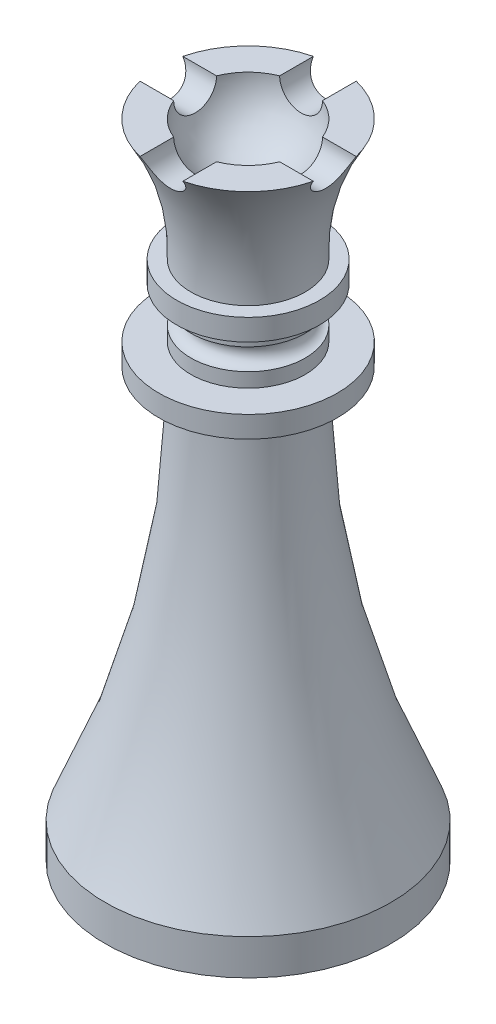
ISO-10303-21;
HEADER;
FILE_DESCRIPTION(('STEP AP214'),'2;1');
FILE_NAME('part.step','',(''),(''),'','','');
FILE_SCHEMA(('AUTOMOTIVE_DESIGN { 1 0 10303 214 1 1 1 1 }'));
ENDSEC;
DATA;
#1=APPLICATION_CONTEXT('core data for automotive mechanical design processes');
#2=APPLICATION_PROTOCOL_DEFINITION('international standard','automotive_design',2000,#1);
#3=PRODUCT_CONTEXT('',#1,'mechanical');
#4=PRODUCT('Part','Part','',(#3));
#5=PRODUCT_RELATED_PRODUCT_CATEGORY('part','',(#4));
#6=PRODUCT_DEFINITION_FORMATION('','',#4);
#7=PRODUCT_DEFINITION_CONTEXT('part definition',#1,'design');
#8=PRODUCT_DEFINITION('design','',#6,#7);
#9=PRODUCT_DEFINITION_SHAPE('','',#8);
#10=(LENGTH_UNIT() NAMED_UNIT(*) SI_UNIT(.MILLI.,.METRE.));
#11=(NAMED_UNIT(*) PLANE_ANGLE_UNIT() SI_UNIT($,.RADIAN.));
#12=(NAMED_UNIT(*) SI_UNIT($,.STERADIAN.) SOLID_ANGLE_UNIT());
#13=UNCERTAINTY_MEASURE_WITH_UNIT(LENGTH_MEASURE(1.E-05),#10,'distance_accuracy_value','');
#14=(GEOMETRIC_REPRESENTATION_CONTEXT(3) GLOBAL_UNCERTAINTY_ASSIGNED_CONTEXT((#13)) GLOBAL_UNIT_ASSIGNED_CONTEXT((#10,
#11,#12)) REPRESENTATION_CONTEXT('',''));
#15=CARTESIAN_POINT('',(0.,0.,0.));
#16=DIRECTION('',(0.,0.,1.));
#17=DIRECTION('',(1.,0.,0.));
#18=AXIS2_PLACEMENT_3D('',#15,#16,#17);
#19=CARTESIAN_POINT('',(4.8,18.,0.));
#20=DIRECTION('',(0.,1.,0.));
#21=DIRECTION('',(0.,0.,1.));
#22=AXIS2_PLACEMENT_3D('',#19,#20,#21);
#23=PLANE('',#22);
#24=DIRECTION('',(1.,0.,0.));
#25=VECTOR('',#24,1.);
#26=CARTESIAN_POINT('',(-12.0006000000001,18.,1.79999999999987));
#27=LINE('',#26,#25);
#28=CARTESIAN_POINT('',(-4.44971909225742,18.,1.79999999999995));
#29=VERTEX_POINT('',#28);
#30=CARTESIAN_POINT('',(-7.28079665970697,18.,1.79999999999992));
#31=VERTEX_POINT('',#30);
#32=EDGE_CURVE('E50',#29,#31,#27,.F.);
#33=ORIENTED_EDGE('',*,*,#32,.T.);
#34=CARTESIAN_POINT('',(0.,18.,0.));
#35=DIRECTION('',(0.,-1.,0.));
#36=DIRECTION('',(0.,0.,-1.));
#37=AXIS2_PLACEMENT_3D('',#34,#35,#36);
#38=CIRCLE('',#37,7.49999999999999);
#39=CARTESIAN_POINT('',(-1.8,18.,7.28079665970695));
#40=VERTEX_POINT('',#39);
#41=EDGE_CURVE('E132',#40,#31,#38,.T.);
#42=ORIENTED_EDGE('',*,*,#41,.F.);
#43=DIRECTION('',(0.,0.,-1.));
#44=VECTOR('',#43,1.);
#45=CARTESIAN_POINT('',(-1.8,18.,12.0006));
#46=LINE('',#45,#44);
#47=CARTESIAN_POINT('',(-1.8,18.,4.4497190922574));
#48=VERTEX_POINT('',#47);
#49=EDGE_CURVE('E146',#40,#48,#46,.T.);
#50=ORIENTED_EDGE('',*,*,#49,.T.);
#51=CARTESIAN_POINT('',(0.,18.,0.));
#52=DIRECTION('',(0.,-1.,0.));
#53=DIRECTION('',(0.,0.,-1.));
#54=AXIS2_PLACEMENT_3D('',#51,#52,#53);
#55=CIRCLE('',#54,4.8);
#56=EDGE_CURVE('E119',#48,#29,#55,.T.);
#57=ORIENTED_EDGE('',*,*,#56,.T.);
#58=EDGE_LOOP('',(#33,#42,#50,#57));
#59=FACE_BOUND('',#58,.T.);
#60=ADVANCED_FACE('F35',(#59),#23,.T.);
#61=DIRECTION('',(0.,0.,-1.));
#62=VECTOR('',#61,1.);
#63=CARTESIAN_POINT('',(1.8,18.,12.0006));
#64=LINE('',#63,#62);
#65=CARTESIAN_POINT('',(1.8,18.,4.4497190922574));
#66=VERTEX_POINT('',#65);
#67=CARTESIAN_POINT('',(1.8,18.,7.28079665970695));
#68=VERTEX_POINT('',#67);
#69=EDGE_CURVE('E58',#66,#68,#64,.F.);
#70=ORIENTED_EDGE('',*,*,#69,.T.);
#71=CARTESIAN_POINT('',(7.28079665970695,18.,1.80000000000003));
#72=VERTEX_POINT('',#71);
#73=EDGE_CURVE('E217',#72,#68,#38,.T.);
#74=ORIENTED_EDGE('',*,*,#73,.F.);
#75=DIRECTION('',(-1.,0.,0.));
#76=VECTOR('',#75,1.);
#77=CARTESIAN_POINT('',(12.0006,18.,1.80000000000004));
#78=LINE('',#77,#76);
#79=CARTESIAN_POINT('',(4.44971909225739,18.,1.80000000000002));
#80=VERTEX_POINT('',#79);
#81=EDGE_CURVE('E141',#72,#80,#78,.T.);
#82=ORIENTED_EDGE('',*,*,#81,.T.);
#83=EDGE_CURVE('E123',#80,#66,#55,.T.);
#84=ORIENTED_EDGE('',*,*,#83,.T.);
#85=EDGE_LOOP('',(#70,#74,#82,#84));
#86=FACE_BOUND('',#85,.T.);
#87=ADVANCED_FACE('F138',(#86),#23,.T.);
#88=DIRECTION('',(-1.,0.,0.));
#89=VECTOR('',#88,1.);
#90=CARTESIAN_POINT('',(12.0006000000001,18.,-1.79999999999996));
#91=LINE('',#90,#89);
#92=CARTESIAN_POINT('',(4.4497190922574,18.,-1.79999999999998));
#93=VERTEX_POINT('',#92);
#94=CARTESIAN_POINT('',(7.28079665970696,18.,-1.79999999999997));
#95=VERTEX_POINT('',#94);
#96=EDGE_CURVE('E206',#93,#95,#91,.F.);
#97=ORIENTED_EDGE('',*,*,#96,.T.);
#98=CARTESIAN_POINT('',(1.8,18.,-7.28079665970695));
#99=VERTEX_POINT('',#98);
#100=EDGE_CURVE('E133',#99,#95,#38,.T.);
#101=ORIENTED_EDGE('',*,*,#100,.F.);
#102=DIRECTION('',(0.,0.,1.));
#103=VECTOR('',#102,1.);
#104=CARTESIAN_POINT('',(1.8,18.,-12.0006));
#105=LINE('',#104,#103);
#106=CARTESIAN_POINT('',(1.8,18.,-4.4497190922574));
#107=VERTEX_POINT('',#106);
#108=EDGE_CURVE('E451',#99,#107,#105,.T.);
#109=ORIENTED_EDGE('',*,*,#108,.T.);
#110=EDGE_CURVE('E122',#107,#93,#55,.T.);
#111=ORIENTED_EDGE('',*,*,#110,.T.);
#112=EDGE_LOOP('',(#97,#101,#109,#111));
#113=FACE_BOUND('',#112,.T.);
#114=ADVANCED_FACE('F187',(#113),#23,.T.);
#115=CARTESIAN_POINT('',(0.,-1.2,0.));
#116=DIRECTION('',(0.,-1.,0.));
#117=DIRECTION('',(0.,0.,-1.));
#118=AXIS2_PLACEMENT_3D('',#115,#116,#117);
#119=TOROIDAL_SURFACE('',#118,6.00520466909825,1.2);
#120=CARTESIAN_POINT('',(0.,0.,0.));
#121=DIRECTION('',(0.,-1.,0.));
#122=DIRECTION('',(0.,0.,-1.));
#123=AXIS2_PLACEMENT_3D('',#120,#121,#122);
#124=CIRCLE('',#123,6.00520466909825);
#125=CARTESIAN_POINT('',(0.,0.,-6.00520466909825));
#126=VERTEX_POINT('',#125);
#127=EDGE_CURVE('E11',#126,#126,#124,.T.);
#128=ORIENTED_EDGE('',*,*,#127,.T.);
#129=EDGE_LOOP('',(#128));
#130=FACE_BOUND('',#129,.T.);
#131=CARTESIAN_POINT('',(0.,-1.2145723013904,0.));
#132=DIRECTION('',(0.,-1.,0.));
#133=DIRECTION('',(0.,0.,-1.));
#134=AXIS2_PLACEMENT_3D('',#131,#132,#133);
#135=CIRCLE('',#134,4.80529315234703);
#136=CARTESIAN_POINT('',(0.,-1.2145723013904,-4.80529315234703));
#137=VERTEX_POINT('',#136);
#138=EDGE_CURVE('E460',#137,#137,#135,.T.);
#139=ORIENTED_EDGE('',*,*,#138,.F.);
#140=EDGE_LOOP('',(#139));
#141=FACE_BOUND('',#140,.T.);
#142=ADVANCED_FACE('F37',(#130,#141),#119,.F.);
#143=CARTESIAN_POINT('',(6.00520466909825,0.,0.));
#144=DIRECTION('',(0.,-1.,0.));
#145=DIRECTION('',(0.,0.,-1.));
#146=AXIS2_PLACEMENT_3D('',#143,#144,#145);
#147=PLANE('',#146);
#148=CARTESIAN_POINT('',(0.,0.,0.));
#149=DIRECTION('',(0.,-1.,0.));
#150=DIRECTION('',(0.,0.,-1.));
#151=AXIS2_PLACEMENT_3D('',#148,#149,#150);
#152=CIRCLE('',#151,7.5);
#153=CARTESIAN_POINT('',(0.,0.,-7.5));
#154=VERTEX_POINT('',#153);
#155=EDGE_CURVE('E43',#154,#154,#152,.T.);
#156=ORIENTED_EDGE('',*,*,#155,.T.);
#157=EDGE_LOOP('',(#156));
#158=FACE_BOUND('',#157,.T.);
#159=ORIENTED_EDGE('',*,*,#127,.F.);
#160=EDGE_LOOP('',(#159));
#161=FACE_BOUND('',#160,.T.);
#162=ADVANCED_FACE('F203',(#158,#161),#147,.T.);
#163=CARTESIAN_POINT('',(0.,0.,0.));
#164=DIRECTION('',(0.,-1.,0.));
#165=DIRECTION('',(0.,0.,-1.));
#166=AXIS2_PLACEMENT_3D('',#163,#164,#165);
#167=CYLINDRICAL_SURFACE('',#166,7.5);
#168=CARTESIAN_POINT('',(0.,1.8,0.));
#169=DIRECTION('',(0.,-1.,0.));
#170=DIRECTION('',(0.,0.,-1.));
#171=AXIS2_PLACEMENT_3D('',#168,#169,#170);
#172=CIRCLE('',#171,7.5);
#173=CARTESIAN_POINT('',(0.,1.8,-7.5));
#174=VERTEX_POINT('',#173);
#175=EDGE_CURVE('E239',#174,#174,#172,.T.);
#176=ORIENTED_EDGE('',*,*,#175,.T.);
#177=EDGE_LOOP('',(#176));
#178=FACE_BOUND('',#177,.T.);
#179=ORIENTED_EDGE('',*,*,#155,.F.);
#180=EDGE_LOOP('',(#179));
#181=FACE_BOUND('',#180,.T.);
#182=ADVANCED_FACE('F246',(#178,#181),#167,.T.);
#183=CARTESIAN_POINT('',(7.5,1.8,0.));
#184=DIRECTION('',(0.,1.,0.));
#185=DIRECTION('',(0.,0.,1.));
#186=AXIS2_PLACEMENT_3D('',#183,#184,#185);
#187=PLANE('',#186);
#188=CARTESIAN_POINT('',(0.,1.8,0.));
#189=DIRECTION('',(0.,-1.,0.));
#190=DIRECTION('',(0.,0.,-1.));
#191=AXIS2_PLACEMENT_3D('',#188,#189,#190);
#192=CIRCLE('',#191,4.8);
#193=CARTESIAN_POINT('',(0.,1.8,-4.8));
#194=VERTEX_POINT('',#193);
#195=EDGE_CURVE('E236',#194,#194,#192,.T.);
#196=ORIENTED_EDGE('',*,*,#195,.T.);
#197=EDGE_LOOP('',(#196));
#198=FACE_BOUND('',#197,.T.);
#199=ORIENTED_EDGE('',*,*,#175,.F.);
#200=EDGE_LOOP('',(#199));
#201=FACE_BOUND('',#200,.T.);
#202=ADVANCED_FACE('F248',(#198,#201),#187,.T.);
#203=CARTESIAN_POINT('',(0.,0.,0.));
#204=DIRECTION('',(0.,-1.,0.));
#205=DIRECTION('',(0.,0.,-1.));
#206=AXIS2_PLACEMENT_3D('',#203,#204,#205);
#207=CYLINDRICAL_SURFACE('',#206,4.8);
#208=CARTESIAN_POINT('',(0.,3.,0.));
#209=DIRECTION('',(0.,-1.,0.));
#210=DIRECTION('',(0.,0.,-1.));
#211=AXIS2_PLACEMENT_3D('',#208,#209,#210);
#212=CIRCLE('',#211,4.8);
#213=CARTESIAN_POINT('',(0.,3.,-4.8));
#214=VERTEX_POINT('',#213);
#215=EDGE_CURVE('E233',#214,#214,#212,.T.);
#216=ORIENTED_EDGE('',*,*,#215,.T.);
#217=EDGE_LOOP('',(#216));
#218=FACE_BOUND('',#217,.T.);
#219=ORIENTED_EDGE('',*,*,#195,.F.);
#220=EDGE_LOOP('',(#219));
#221=FACE_BOUND('',#220,.T.);
#222=ADVANCED_FACE('F255',(#218,#221),#207,.T.);
#223=CARTESIAN_POINT('',(0.,3.9,0.));
#224=DIRECTION('',(0.,-1.,0.));
#225=DIRECTION('',(0.,0.,-1.));
#226=AXIS2_PLACEMENT_3D('',#223,#224,#225);
#227=TOROIDAL_SURFACE('',#226,4.8,0.9);
#228=CARTESIAN_POINT('',(0.,4.8,0.));
#229=DIRECTION('',(0.,-1.,0.));
#230=DIRECTION('',(0.,0.,-1.));
#231=AXIS2_PLACEMENT_3D('',#228,#229,#230);
#232=CIRCLE('',#231,4.8);
#233=CARTESIAN_POINT('',(0.,4.8,-4.8));
#234=VERTEX_POINT('',#233);
#235=EDGE_CURVE('E230',#234,#234,#232,.T.);
#236=ORIENTED_EDGE('',*,*,#235,.T.);
#237=EDGE_LOOP('',(#236));
#238=FACE_BOUND('',#237,.T.);
#239=ORIENTED_EDGE('',*,*,#215,.F.);
#240=EDGE_LOOP('',(#239));
#241=FACE_BOUND('',#240,.T.);
#242=ADVANCED_FACE('F261',(#238,#241),#227,.F.);
#243=CARTESIAN_POINT('',(0.,0.,0.));
#244=DIRECTION('',(0.,-1.,0.));
#245=DIRECTION('',(0.,0.,-1.));
#246=AXIS2_PLACEMENT_3D('',#243,#244,#245);
#247=CYLINDRICAL_SURFACE('',#246,4.8);
#248=CARTESIAN_POINT('',(0.,6.,0.));
#249=DIRECTION('',(0.,-1.,0.));
#250=DIRECTION('',(0.,0.,-1.));
#251=AXIS2_PLACEMENT_3D('',#248,#249,#250);
#252=CIRCLE('',#251,4.8);
#253=CARTESIAN_POINT('',(0.,6.,-4.8));
#254=VERTEX_POINT('',#253);
#255=EDGE_CURVE('E227',#254,#254,#252,.T.);
#256=ORIENTED_EDGE('',*,*,#255,.T.);
#257=EDGE_LOOP('',(#256));
#258=FACE_BOUND('',#257,.T.);
#259=ORIENTED_EDGE('',*,*,#235,.F.);
#260=EDGE_LOOP('',(#259));
#261=FACE_BOUND('',#260,.T.);
#262=ADVANCED_FACE('F265',(#258,#261),#247,.T.);
#263=CARTESIAN_POINT('',(4.8,6.,0.));
#264=DIRECTION('',(0.,-1.,0.));
#265=DIRECTION('',(0.,0.,-1.));
#266=AXIS2_PLACEMENT_3D('',#263,#264,#265);
#267=PLANE('',#266);
#268=CARTESIAN_POINT('',(0.,6.,0.));
#269=DIRECTION('',(0.,-1.,0.));
#270=DIRECTION('',(0.,0.,-1.));
#271=AXIS2_PLACEMENT_3D('',#268,#269,#270);
#272=CIRCLE('',#271,6.);
#273=CARTESIAN_POINT('',(0.,6.,-6.));
#274=VERTEX_POINT('',#273);
#275=EDGE_CURVE('E224',#274,#274,#272,.T.);
#276=ORIENTED_EDGE('',*,*,#275,.T.);
#277=EDGE_LOOP('',(#276));
#278=FACE_BOUND('',#277,.T.);
#279=ORIENTED_EDGE('',*,*,#255,.F.);
#280=EDGE_LOOP('',(#279));
#281=FACE_BOUND('',#280,.T.);
#282=ADVANCED_FACE('F269',(#278,#281),#267,.T.);
#283=CARTESIAN_POINT('',(0.,0.,0.));
#284=DIRECTION('',(0.,-1.,0.));
#285=DIRECTION('',(0.,0.,-1.));
#286=AXIS2_PLACEMENT_3D('',#283,#284,#285);
#287=CYLINDRICAL_SURFACE('',#286,6.);
#288=CARTESIAN_POINT('',(0.,7.8,0.));
#289=DIRECTION('',(0.,-1.,0.));
#290=DIRECTION('',(0.,0.,-1.));
#291=AXIS2_PLACEMENT_3D('',#288,#289,#290);
#292=CIRCLE('',#291,6.);
#293=CARTESIAN_POINT('',(0.,7.8,-6.));
#294=VERTEX_POINT('',#293);
#295=EDGE_CURVE('E219',#294,#294,#292,.T.);
#296=ORIENTED_EDGE('',*,*,#295,.T.);
#297=EDGE_LOOP('',(#296));
#298=FACE_BOUND('',#297,.T.);
#299=ORIENTED_EDGE('',*,*,#275,.F.);
#300=EDGE_LOOP('',(#299));
#301=FACE_BOUND('',#300,.T.);
#302=ADVANCED_FACE('F273',(#298,#301),#287,.T.);
#303=CARTESIAN_POINT('',(6.,7.8,0.));
#304=DIRECTION('',(0.,1.,0.));
#305=DIRECTION('',(0.,0.,1.));
#306=AXIS2_PLACEMENT_3D('',#303,#304,#305);
#307=PLANE('',#306);
#308=CARTESIAN_POINT('',(0.,7.8,0.));
#309=DIRECTION('',(0.,-1.,0.));
#310=DIRECTION('',(0.,0.,-1.));
#311=AXIS2_PLACEMENT_3D('',#308,#309,#310);
#312=CIRCLE('',#311,4.8);
#313=CARTESIAN_POINT('',(0.,7.8,-4.8));
#314=VERTEX_POINT('',#313);
#315=EDGE_CURVE('E216',#314,#314,#312,.T.);
#316=ORIENTED_EDGE('',*,*,#315,.T.);
#317=EDGE_LOOP('',(#316));
#318=FACE_BOUND('',#317,.T.);
#319=ORIENTED_EDGE('',*,*,#295,.F.);
#320=EDGE_LOOP('',(#319));
#321=FACE_BOUND('',#320,.T.);
#322=ADVANCED_FACE('F197',(#318,#321),#307,.T.);
#323=CARTESIAN_POINT('',(0.,8.49621244997309,0.));
#324=DIRECTION('',(0.,-1.,0.));
#325=DIRECTION('',(0.,0.,-1.));
#326=AXIS2_PLACEMENT_3D('',#323,#324,#325);
#327=TOROIDAL_SURFACE('',#326,22.7865307445461,18.);
#328=CARTESIAN_POINT('',(-7.28087351267607,18.00012,1.79999999599992));
#329=CARTESIAN_POINT('',(-7.24916617027994,17.9506223303307,1.80000215189279));
#330=CARTESIAN_POINT('',(-7.21805172621514,17.9007251378603,1.79796411662472));
#331=CARTESIAN_POINT('',(-7.15722805121233,17.8003749392502,1.78960593091639));
#332=CARTESIAN_POINT('',(-7.12752015664346,17.7499214585342,1.78328179223978));
#333=CARTESIAN_POINT('',(-7.06960466253087,17.648472319788,1.7660942121074));
#334=CARTESIAN_POINT('',(-7.04140785623858,17.597475257003,1.75520203855294));
#335=CARTESIAN_POINT('',(-6.98698157246766,17.4956909632383,1.72871134919193));
#336=CARTESIAN_POINT('',(-6.96075155315397,17.4449036781368,1.71311413558055));
#337=CARTESIAN_POINT('',(-6.88504352640613,17.2928834323424,1.65878766276784));
#338=CARTESIAN_POINT('',(-6.83884610541201,17.1925151329813,1.61260682870859));
#339=CARTESIAN_POINT('',(-6.75678019145648,16.9993777584201,1.50038994989352));
#340=CARTESIAN_POINT('',(-6.72087600032118,16.9065832376743,1.43442419168422));
#341=CARTESIAN_POINT('',(-6.66330321412852,16.7448100534106,1.2939949132804));
#342=CARTESIAN_POINT('',(-6.64038232546986,16.674304381268,1.22179590806877));
#343=CARTESIAN_POINT('',(-6.60145681274396,16.5456428856014,1.06540911029223));
#344=CARTESIAN_POINT('',(-6.58545635623346,16.487494514464,0.981214134083377));
#345=CARTESIAN_POINT('',(-6.55998968365932,16.3888871413604,0.808489692967561));
#346=CARTESIAN_POINT('',(-6.55020861997914,16.3476219920511,0.720464409230753));
#347=CARTESIAN_POINT('',(-6.53482212550733,16.2797369937203,0.53861961897347));
#348=CARTESIAN_POINT('',(-6.52921572661702,16.2531137496368,0.444801461280314));
#349=CARTESIAN_POINT('',(-6.52138761421463,16.2151598327125,0.252987567009421));
#350=CARTESIAN_POINT('',(-6.51920109238057,16.2039882968441,0.154958925295463));
#351=CARTESIAN_POINT('',(-6.51797714866226,16.1977957332527,-0.0416371081884089));
#352=CARTESIAN_POINT('',(-6.51894013192743,16.2027767833826,-0.140204567643051));
#353=CARTESIAN_POINT('',(-6.52419512901589,16.2288582600712,-0.336001575315837));
#354=CARTESIAN_POINT('',(-6.52851697791746,16.2501031242723,-0.433211143638304));
#355=CARTESIAN_POINT('',(-6.54116902238999,16.3081951497803,-0.622577296306479));
#356=CARTESIAN_POINT('',(-6.54949898738394,16.3450414135625,-0.714734170981491));
#357=CARTESIAN_POINT('',(-6.5710938631276,16.4328193459814,-0.890824617257295));
#358=CARTESIAN_POINT('',(-6.58433178513552,16.4836735990227,-0.974800047080801));
#359=CARTESIAN_POINT('',(-6.61679771000035,16.597647841684,-1.13264282743203));
#360=CARTESIAN_POINT('',(-6.63602437814315,16.6607650970659,-1.20651242497605));
#361=CARTESIAN_POINT('',(-6.68096570563203,16.7958246445256,-1.34124461454933));
#362=CARTESIAN_POINT('',(-6.70658749236937,16.8676336175698,-1.40227213024131));
#363=CARTESIAN_POINT('',(-6.76472214580957,17.0179549494183,-1.51136207733418));
#364=CARTESIAN_POINT('',(-6.79723479794307,17.096467099452,-1.55942491232643));
#365=CARTESIAN_POINT('',(-6.86964488948432,17.2592019158343,-1.6431022342097));
#366=CARTESIAN_POINT('',(-6.90969229368526,17.3435134199238,-1.67841164336858));
#367=CARTESIAN_POINT('',(-6.99585254581702,17.5136687992768,-1.73537914236019));
#368=CARTESIAN_POINT('',(-7.04196946845849,17.5995136701892,-1.75702800423845));
#369=CARTESIAN_POINT('',(-7.12061107921281,17.7380923403486,-1.78166033014048));
#370=CARTESIAN_POINT('',(-7.15164605937848,17.7910191251901,-1.78861008181122));
#371=CARTESIAN_POINT('',(-7.21519684792118,17.8961434025204,-1.79777149136061));
#372=CARTESIAN_POINT('',(-7.24770713490367,17.9483427903359,-1.79999953226508));
#373=CARTESIAN_POINT('',(-7.28087351267603,18.00012,-1.79999999600008));
#374=B_SPLINE_CURVE_WITH_KNOTS('',3,(#328,#329,#330,#331,#332,#333,#334,#335,#336,#337,#338,
#339,#340,#341,#342,#343,#344,#345,#346,#347,#348,#349,#350,#351,#352,#353,#354,#355,#356,#357,
#358,#359,#360,#361,#362,#363,#364,#365,#366,#367,#368,#369,#370,#371,#372,#373),.UNSPECIFIED.,
.F.,.F.,(4,2,2,2,2,2,2,2,2,2,2,2,2,2,2,2,2,2,2,2,2,2,4),(0.,0.176331092545598,0.352826487557667,
0.530449061959675,0.708022521502711,1.06496793454961,1.42066001275283,1.7294910741004,
2.03850785867151,2.33027781927276,2.62198009775566,2.91666479175441,3.21138739521068,
3.50875821302089,3.80611192586775,4.10185418091668,4.39753057088123,4.68914024376748,
4.9807408377779,5.27891557694475,5.57729152368256,5.76234758561024,5.94676049594349),.UNSPECIFIED.);
#375=CARTESIAN_POINT('',(-7.28079665970693,18.,-1.80000000000008));
#376=VERTEX_POINT('',#375);
#377=EDGE_CURVE('E147',#31,#376,#374,.T.);
#378=ORIENTED_EDGE('',*,*,#377,.T.);
#379=CARTESIAN_POINT('',(-1.8,18.,-7.28079665970695));
#380=VERTEX_POINT('',#379);
#381=EDGE_CURVE('E113',#376,#380,#38,.T.);
#382=ORIENTED_EDGE('',*,*,#381,.T.);
#383=CARTESIAN_POINT('',(-1.799999996,18.00012,-7.28087351267605));
#384=CARTESIAN_POINT('',(-1.80000215189286,17.9506223303307,-7.24916617027993));
#385=CARTESIAN_POINT('',(-1.79796411662479,17.9007251378603,-7.21805172621512));
#386=CARTESIAN_POINT('',(-1.78960593091647,17.8003749392502,-7.15722805121231));
#387=CARTESIAN_POINT('',(-1.78328179223986,17.7499214585342,-7.12752015664344));
#388=CARTESIAN_POINT('',(-1.76609421210747,17.648472319788,-7.06960466253086));
#389=CARTESIAN_POINT('',(-1.75520203855302,17.597475257003,-7.04140785623857));
#390=CARTESIAN_POINT('',(-1.728711349192,17.4956909632383,-6.98698157246765));
#391=CARTESIAN_POINT('',(-1.71311413558062,17.4449036781368,-6.96075155315395));
#392=CARTESIAN_POINT('',(-1.65878766276791,17.2928834323424,-6.88504352640611));
#393=CARTESIAN_POINT('',(-1.61260682870866,17.1925151329813,-6.83884610541199));
#394=CARTESIAN_POINT('',(-1.50038994989359,16.9993777584201,-6.75678019145646));
#395=CARTESIAN_POINT('',(-1.4344241916843,16.9065832376743,-6.72087600032118));
#396=CARTESIAN_POINT('',(-1.29399491328047,16.7448100534106,-6.66330321412851));
#397=CARTESIAN_POINT('',(-1.22179590806885,16.674304381268,-6.64038232546985));
#398=CARTESIAN_POINT('',(-1.0654091102923,16.5456428856014,-6.60145681274395));
#399=CARTESIAN_POINT('',(-0.981214134083451,16.487494514464,-6.58545635623346));
#400=CARTESIAN_POINT('',(-0.808489692967636,16.3888871413604,-6.55998968365932));
#401=CARTESIAN_POINT('',(-0.720464409230828,16.3476219920511,-6.55020861997914));
#402=CARTESIAN_POINT('',(-0.538619618973545,16.2797369937203,-6.53482212550733));
#403=CARTESIAN_POINT('',(-0.444801461280389,16.2531137496368,-6.52921572661702));
#404=CARTESIAN_POINT('',(-0.252987567009496,16.2151598327125,-6.52138761421463));
#405=CARTESIAN_POINT('',(-0.154958925295538,16.2039882968441,-6.51920109238057));
#406=CARTESIAN_POINT('',(0.0416371081883339,16.1977957332527,-6.51797714866226));
#407=CARTESIAN_POINT('',(0.140204567642976,16.2027767833826,-6.51894013192743));
#408=CARTESIAN_POINT('',(0.336001575315762,16.2288582600712,-6.52419512901589));
#409=CARTESIAN_POINT('',(0.433211143638228,16.2501031242723,-6.52851697791747));
#410=CARTESIAN_POINT('',(0.622577296306404,16.3081951497803,-6.54116902239));
#411=CARTESIAN_POINT('',(0.714734170981417,16.3450414135625,-6.54949898738395));
#412=CARTESIAN_POINT('',(0.890824617257222,16.4328193459813,-6.57109386312761));
#413=CARTESIAN_POINT('',(0.974800047080727,16.4836735990227,-6.58433178513553));
#414=CARTESIAN_POINT('',(1.13264282743195,16.597647841684,-6.61679771000037));
#415=CARTESIAN_POINT('',(1.20651242497598,16.6607650970658,-6.63602437814316));
#416=CARTESIAN_POINT('',(1.34124461454925,16.7958246445256,-6.68096570563204));
#417=CARTESIAN_POINT('',(1.40227213024123,16.8676336175698,-6.70658749236939));
#418=CARTESIAN_POINT('',(1.51136207733411,17.0179549494183,-6.76472214580959));
#419=CARTESIAN_POINT('',(1.55942491232636,17.096467099452,-6.79723479794309));
#420=CARTESIAN_POINT('',(1.64310223420962,17.2592019158343,-6.86964488948434));
#421=CARTESIAN_POINT('',(1.6784116433685,17.3435134199238,-6.90969229368528));
#422=CARTESIAN_POINT('',(1.73537914236011,17.5136687992768,-6.99585254581704));
#423=CARTESIAN_POINT('',(1.75702800423838,17.5995136701892,-7.04196946845851));
#424=CARTESIAN_POINT('',(1.78166033014041,17.7380923403486,-7.12061107921283));
#425=CARTESIAN_POINT('',(1.78861008181115,17.7910191251901,-7.1516460593785));
#426=CARTESIAN_POINT('',(1.79777149136053,17.8961434025204,-7.2151968479212));
#427=CARTESIAN_POINT('',(1.799999532265,17.9483427903359,-7.24770713490369));
#428=CARTESIAN_POINT('',(1.799999996,18.00012,-7.28087351267605));
#429=B_SPLINE_CURVE_WITH_KNOTS('',3,(#383,#384,#385,#386,#387,#388,#389,#390,#391,#392,#393,
#394,#395,#396,#397,#398,#399,#400,#401,#402,#403,#404,#405,#406,#407,#408,#409,#410,#411,#412,
#413,#414,#415,#416,#417,#418,#419,#420,#421,#422,#423,#424,#425,#426,#427,#428),.UNSPECIFIED.,
.F.,.F.,(4,2,2,2,2,2,2,2,2,2,2,2,2,2,2,2,2,2,2,2,2,2,4),(0.,0.176331092545597,0.352826487557667,
0.53044906195967,0.708022521502708,1.06496793454961,1.42066001275283,1.72949107410039,
2.03850785867151,2.33027781927275,2.62198009775565,2.9166647917544,3.21138739521067,
3.50875821302088,3.80611192586774,4.10185418091667,4.39753057088122,4.68914024376748,
4.98074083777789,5.27891557694475,5.57729152368256,5.76234758561023,5.94676049594348),.UNSPECIFIED.);
#430=EDGE_CURVE('E215',#380,#99,#429,.T.);
#431=ORIENTED_EDGE('',*,*,#430,.T.);
#432=ORIENTED_EDGE('',*,*,#100,.T.);
#433=CARTESIAN_POINT('',(7.28087351267606,18.00012,-1.79999999599997));
#434=CARTESIAN_POINT('',(7.24916617027993,17.9506223303307,-1.80000215189284));
#435=CARTESIAN_POINT('',(7.21805172621513,17.9007251378603,-1.79796411662477));
#436=CARTESIAN_POINT('',(7.15722805121232,17.8003749392502,-1.78960593091644));
#437=CARTESIAN_POINT('',(7.12752015664345,17.7499214585342,-1.78328179223983));
#438=CARTESIAN_POINT('',(7.06960466253086,17.648472319788,-1.76609421210745));
#439=CARTESIAN_POINT('',(7.04140785623857,17.597475257003,-1.75520203855299));
#440=CARTESIAN_POINT('',(6.98698157246766,17.4956909632383,-1.72871134919198));
#441=CARTESIAN_POINT('',(6.96075155315396,17.4449036781368,-1.7131141355806));
#442=CARTESIAN_POINT('',(6.88504352640612,17.2928834323424,-1.65878766276789));
#443=CARTESIAN_POINT('',(6.838846105412,17.1925151329813,-1.61260682870864));
#444=CARTESIAN_POINT('',(6.75678019145647,16.9993777584201,-1.50038994989357));
#445=CARTESIAN_POINT('',(6.72087600032117,16.9065832376743,-1.43442419168427));
#446=CARTESIAN_POINT('',(6.66330321412851,16.7448100534106,-1.29399491328045));
#447=CARTESIAN_POINT('',(6.64038232546985,16.674304381268,-1.22179590806882));
#448=CARTESIAN_POINT('',(6.60145681274395,16.5456428856014,-1.06540911029228));
#449=CARTESIAN_POINT('',(6.58545635623346,16.487494514464,-0.981214134083425));
#450=CARTESIAN_POINT('',(6.55998968365932,16.3888871413604,-0.808489692967608));
#451=CARTESIAN_POINT('',(6.55020861997914,16.3476219920511,-0.7204644092308));
#452=CARTESIAN_POINT('',(6.53482212550733,16.2797369937203,-0.538619618973518));
#453=CARTESIAN_POINT('',(6.52921572661702,16.2531137496368,-0.444801461280361));
#454=CARTESIAN_POINT('',(6.52138761421463,16.2151598327125,-0.252987567009468));
#455=CARTESIAN_POINT('',(6.51920109238057,16.2039882968441,-0.15495892529551));
#456=CARTESIAN_POINT('',(6.51797714866226,16.1977957332527,0.041637108188361));
#457=CARTESIAN_POINT('',(6.51894013192743,16.2027767833826,0.140204567643003));
#458=CARTESIAN_POINT('',(6.52419512901589,16.2288582600712,0.336001575315789));
#459=CARTESIAN_POINT('',(6.52851697791747,16.2501031242723,0.433211143638256));
#460=CARTESIAN_POINT('',(6.54116902239,16.3081951497803,0.622577296306432));
#461=CARTESIAN_POINT('',(6.54949898738394,16.3450414135625,0.714734170981444));
#462=CARTESIAN_POINT('',(6.57109386312761,16.4328193459813,0.890824617257247));
#463=CARTESIAN_POINT('',(6.58433178513553,16.4836735990227,0.974800047080752));
#464=CARTESIAN_POINT('',(6.61679771000036,16.597647841684,1.13264282743198));
#465=CARTESIAN_POINT('',(6.63602437814315,16.6607650970659,1.20651242497601));
#466=CARTESIAN_POINT('',(6.68096570563204,16.7958246445256,1.34124461454928));
#467=CARTESIAN_POINT('',(6.70658749236938,16.8676336175698,1.40227213024126));
#468=CARTESIAN_POINT('',(6.76472214580959,17.0179549494183,1.51136207733414));
#469=CARTESIAN_POINT('',(6.79723479794308,17.096467099452,1.55942491232638));
#470=CARTESIAN_POINT('',(6.86964488948433,17.2592019158343,1.64310223420965));
#471=CARTESIAN_POINT('',(6.90969229368527,17.3435134199238,1.67841164336853));
#472=CARTESIAN_POINT('',(6.99585254581703,17.5136687992768,1.73537914236014));
#473=CARTESIAN_POINT('',(7.04196946845851,17.5995136701892,1.7570280042384));
#474=CARTESIAN_POINT('',(7.12061107921282,17.7380923403486,1.78166033014043));
#475=CARTESIAN_POINT('',(7.15164605937849,17.7910191251901,1.78861008181117));
#476=CARTESIAN_POINT('',(7.2151968479212,17.8961434025204,1.79777149136056));
#477=CARTESIAN_POINT('',(7.24770713490369,17.9483427903359,1.79999953226502));
#478=CARTESIAN_POINT('',(7.28087351267604,18.00012,1.79999999600003));
#479=B_SPLINE_CURVE_WITH_KNOTS('',3,(#433,#434,#435,#436,#437,#438,#439,#440,#441,#442,#443,
#444,#445,#446,#447,#448,#449,#450,#451,#452,#453,#454,#455,#456,#457,#458,#459,#460,#461,#462,
#463,#464,#465,#466,#467,#468,#469,#470,#471,#472,#473,#474,#475,#476,#477,#478),.UNSPECIFIED.,
.F.,.F.,(4,2,2,2,2,2,2,2,2,2,2,2,2,2,2,2,2,2,2,2,2,2,4),(0.,0.176331092545599,0.352826487557668,
0.530449061959671,0.708022521502709,1.06496793454961,1.42066001275283,1.72949107410039,
2.03850785867151,2.33027781927276,2.62198009775565,2.91666479175441,3.21138739521068,
3.50875821302088,3.80611192586775,4.10185418091668,4.39753057088123,4.68914024376748,
4.98074083777789,5.27891557694475,5.57729152368256,5.76234758561024,5.94676049594348),.UNSPECIFIED.);
#480=EDGE_CURVE('E209',#95,#72,#479,.T.);
#481=ORIENTED_EDGE('',*,*,#480,.T.);
#482=ORIENTED_EDGE('',*,*,#73,.T.);
#483=CARTESIAN_POINT('',(1.799999996,18.00012,7.28087351267605));
#484=CARTESIAN_POINT('',(1.80000215189286,17.9506223303307,7.24916617027993));
#485=CARTESIAN_POINT('',(1.79796411662479,17.9007251378603,7.21805172621512));
#486=CARTESIAN_POINT('',(1.78960593091647,17.8003749392502,7.15722805121231));
#487=CARTESIAN_POINT('',(1.78328179223986,17.7499214585342,7.12752015664344));
#488=CARTESIAN_POINT('',(1.76609421210747,17.648472319788,7.06960466253086));
#489=CARTESIAN_POINT('',(1.75520203855302,17.597475257003,7.04140785623857));
#490=CARTESIAN_POINT('',(1.728711349192,17.4956909632383,6.98698157246765));
#491=CARTESIAN_POINT('',(1.71311413558062,17.4449036781368,6.96075155315395));
#492=CARTESIAN_POINT('',(1.65878766276791,17.2928834323424,6.88504352640611));
#493=CARTESIAN_POINT('',(1.61260682870866,17.1925151329813,6.83884610541199));
#494=CARTESIAN_POINT('',(1.50038994989359,16.9993777584201,6.75678019145646));
#495=CARTESIAN_POINT('',(1.4344241916843,16.9065832376743,6.72087600032118));
#496=CARTESIAN_POINT('',(1.29399491328047,16.7448100534106,6.66330321412851));
#497=CARTESIAN_POINT('',(1.22179590806885,16.674304381268,6.64038232546985));
#498=CARTESIAN_POINT('',(1.0654091102923,16.5456428856014,6.60145681274395));
#499=CARTESIAN_POINT('',(0.981214134083451,16.487494514464,6.58545635623346));
#500=CARTESIAN_POINT('',(0.808489692967636,16.3888871413604,6.55998968365932));
#501=CARTESIAN_POINT('',(0.720464409230828,16.3476219920511,6.55020861997914));
#502=CARTESIAN_POINT('',(0.538619618973545,16.2797369937203,6.53482212550733));
#503=CARTESIAN_POINT('',(0.444801461280389,16.2531137496368,6.52921572661702));
#504=CARTESIAN_POINT('',(0.252987567009496,16.2151598327125,6.52138761421463));
#505=CARTESIAN_POINT('',(0.154958925295538,16.2039882968441,6.51920109238057));
#506=CARTESIAN_POINT('',(-0.0416371081883339,16.1977957332527,6.51797714866226));
#507=CARTESIAN_POINT('',(-0.140204567642976,16.2027767833826,6.51894013192743));
#508=CARTESIAN_POINT('',(-0.336001575315762,16.2288582600712,6.52419512901589));
#509=CARTESIAN_POINT('',(-0.433211143638228,16.2501031242723,6.52851697791747));
#510=CARTESIAN_POINT('',(-0.622577296306404,16.3081951497803,6.54116902239));
#511=CARTESIAN_POINT('',(-0.714734170981417,16.3450414135625,6.54949898738395));
#512=CARTESIAN_POINT('',(-0.890824617257222,16.4328193459813,6.57109386312761));
#513=CARTESIAN_POINT('',(-0.974800047080727,16.4836735990227,6.58433178513553));
#514=CARTESIAN_POINT('',(-1.13264282743195,16.597647841684,6.61679771000037));
#515=CARTESIAN_POINT('',(-1.20651242497598,16.6607650970658,6.63602437814316));
#516=CARTESIAN_POINT('',(-1.34124461454925,16.7958246445256,6.68096570563204));
#517=CARTESIAN_POINT('',(-1.40227213024123,16.8676336175698,6.70658749236939));
#518=CARTESIAN_POINT('',(-1.51136207733411,17.0179549494183,6.76472214580959));
#519=CARTESIAN_POINT('',(-1.55942491232636,17.096467099452,6.79723479794309));
#520=CARTESIAN_POINT('',(-1.64310223420962,17.2592019158343,6.86964488948434));
#521=CARTESIAN_POINT('',(-1.6784116433685,17.3435134199238,6.90969229368528));
#522=CARTESIAN_POINT('',(-1.73537914236011,17.5136687992768,6.99585254581704));
#523=CARTESIAN_POINT('',(-1.75702800423838,17.5995136701892,7.04196946845851));
#524=CARTESIAN_POINT('',(-1.78166033014041,17.7380923403486,7.12061107921283));
#525=CARTESIAN_POINT('',(-1.78861008181115,17.7910191251901,7.1516460593785));
#526=CARTESIAN_POINT('',(-1.79777149136053,17.8961434025204,7.2151968479212));
#527=CARTESIAN_POINT('',(-1.799999532265,17.9483427903359,7.24770713490369));
#528=CARTESIAN_POINT('',(-1.799999996,18.00012,7.28087351267605));
#529=B_SPLINE_CURVE_WITH_KNOTS('',3,(#483,#484,#485,#486,#487,#488,#489,#490,#491,#492,#493,
#494,#495,#496,#497,#498,#499,#500,#501,#502,#503,#504,#505,#506,#507,#508,#509,#510,#511,#512,
#513,#514,#515,#516,#517,#518,#519,#520,#521,#522,#523,#524,#525,#526,#527,#528),.UNSPECIFIED.,
.F.,.F.,(4,2,2,2,2,2,2,2,2,2,2,2,2,2,2,2,2,2,2,2,2,2,4),(0.,0.176331092545597,0.352826487557667,
0.53044906195967,0.708022521502708,1.06496793454961,1.42066001275283,1.72949107410039,
2.03850785867151,2.33027781927275,2.62198009775565,2.9166647917544,3.21138739521067,
3.50875821302088,3.80611192586774,4.10185418091667,4.39753057088122,4.68914024376748,
4.98074083777789,5.27891557694475,5.57729152368256,5.76234758561023,5.94676049594348),.UNSPECIFIED.);
#530=EDGE_CURVE('E160',#68,#40,#529,.T.);
#531=ORIENTED_EDGE('',*,*,#530,.T.);
#532=ORIENTED_EDGE('',*,*,#41,.T.);
#533=EDGE_LOOP('',(#378,#382,#431,#432,#481,#482,#531,#532));
#534=FACE_BOUND('',#533,.T.);
#535=ORIENTED_EDGE('',*,*,#315,.F.);
#536=EDGE_LOOP('',(#535));
#537=FACE_BOUND('',#536,.T.);
#538=ADVANCED_FACE('F191',(#534,#537),#327,.F.);
#539=DIRECTION('',(1.,0.,0.));
#540=VECTOR('',#539,1.);
#541=CARTESIAN_POINT('',(-12.0006000000001,18.,-1.80000000000013));
#542=LINE('',#541,#540);
#543=CARTESIAN_POINT('',(-4.44971909225738,18.,-1.80000000000005));
#544=VERTEX_POINT('',#543);
#545=EDGE_CURVE('E100',#376,#544,#542,.T.);
#546=ORIENTED_EDGE('',*,*,#545,.T.);
#547=CARTESIAN_POINT('',(-1.8,18.,-4.4497190922574));
#548=VERTEX_POINT('',#547);
#549=EDGE_CURVE('E111',#544,#548,#55,.T.);
#550=ORIENTED_EDGE('',*,*,#549,.T.);
#551=DIRECTION('',(0.,0.,1.));
#552=VECTOR('',#551,1.);
#553=CARTESIAN_POINT('',(-1.8,18.,-12.0006));
#554=LINE('',#553,#552);
#555=EDGE_CURVE('E453',#548,#380,#554,.F.);
#556=ORIENTED_EDGE('',*,*,#555,.T.);
#557=ORIENTED_EDGE('',*,*,#381,.F.);
#558=EDGE_LOOP('',(#546,#550,#556,#557));
#559=FACE_BOUND('',#558,.T.);
#560=ADVANCED_FACE('F109',(#559),#23,.T.);
#561=CARTESIAN_POINT('',(0.,18.,0.));
#562=DIRECTION('',(0.,-1.,0.));
#563=DIRECTION('',(1.,0.,0.));
#564=AXIS2_PLACEMENT_3D('',#561,#562,#563);
#565=SPHERICAL_SURFACE('',#564,4.8);
#566=CARTESIAN_POINT('',(-4.4497190922574,18.,0.));
#567=DIRECTION('',(1.,0.,0.));
#568=DIRECTION('',(0.,0.,-1.));
#569=AXIS2_PLACEMENT_3D('',#566,#567,#568);
#570=CIRCLE('',#569,1.8);
#571=EDGE_CURVE('E97',#544,#29,#570,.F.);
#572=ORIENTED_EDGE('',*,*,#571,.T.);
#573=ORIENTED_EDGE('',*,*,#56,.F.);
#574=CARTESIAN_POINT('',(0.,18.,4.4497190922574));
#575=DIRECTION('',(0.,0.,-1.));
#576=DIRECTION('',(-1.,0.,0.));
#577=AXIS2_PLACEMENT_3D('',#574,#575,#576);
#578=CIRCLE('',#577,1.8);
#579=EDGE_CURVE('E144',#48,#66,#578,.F.);
#580=ORIENTED_EDGE('',*,*,#579,.T.);
#581=ORIENTED_EDGE('',*,*,#83,.F.);
#582=CARTESIAN_POINT('',(4.4497190922574,18.,0.));
#583=DIRECTION('',(-1.,0.,0.));
#584=DIRECTION('',(0.,0.,1.));
#585=AXIS2_PLACEMENT_3D('',#582,#583,#584);
#586=CIRCLE('',#585,1.8);
#587=EDGE_CURVE('E143',#80,#93,#586,.F.);
#588=ORIENTED_EDGE('',*,*,#587,.T.);
#589=ORIENTED_EDGE('',*,*,#110,.F.);
#590=CARTESIAN_POINT('',(0.,18.,-4.4497190922574));
#591=DIRECTION('',(0.,0.,1.));
#592=DIRECTION('',(1.,0.,0.));
#593=AXIS2_PLACEMENT_3D('',#590,#591,#592);
#594=CIRCLE('',#593,1.8);
#595=EDGE_CURVE('E118',#107,#548,#594,.F.);
#596=ORIENTED_EDGE('',*,*,#595,.T.);
#597=ORIENTED_EDGE('',*,*,#549,.F.);
#598=EDGE_LOOP('',(#572,#573,#580,#581,#588,#589,#596,#597));
#599=FACE_BOUND('',#598,.T.);
#600=ADVANCED_FACE('F116',(#599),#565,.F.);
#601=CARTESIAN_POINT('',(0.,-36.,0.));
#602=DIRECTION('',(0.,-1.,0.));
#603=DIRECTION('',(0.,0.,-1.));
#604=AXIS2_PLACEMENT_3D('',#601,#602,#603);
#605=PLANE('',#604);
#606=CARTESIAN_POINT('',(0.,-36.,0.));
#607=DIRECTION('',(0.,-1.,0.));
#608=DIRECTION('',(0.,0.,-1.));
#609=AXIS2_PLACEMENT_3D('',#606,#607,#608);
#610=CIRCLE('',#609,12.);
#611=CARTESIAN_POINT('',(0.,-36.,-12.));
#612=VERTEX_POINT('',#611);
#613=EDGE_CURVE('E120',#612,#612,#610,.T.);
#614=ORIENTED_EDGE('',*,*,#613,.T.);
#615=EDGE_LOOP('',(#614));
#616=FACE_BOUND('',#615,.T.);
#617=ADVANCED_FACE('F196',(#616),#605,.T.);
#618=CARTESIAN_POINT('',(0.,0.,0.));
#619=DIRECTION('',(0.,-1.,0.));
#620=DIRECTION('',(0.,0.,-1.));
#621=AXIS2_PLACEMENT_3D('',#618,#619,#620);
#622=CYLINDRICAL_SURFACE('',#621,12.);
#623=CARTESIAN_POINT('',(0.,-33.,0.));
#624=DIRECTION('',(0.,-1.,0.));
#625=DIRECTION('',(0.,0.,-1.));
#626=AXIS2_PLACEMENT_3D('',#623,#624,#625);
#627=CIRCLE('',#626,12.);
#628=CARTESIAN_POINT('',(0.,-33.,-12.));
#629=VERTEX_POINT('',#628);
#630=EDGE_CURVE('E125',#629,#629,#627,.T.);
#631=ORIENTED_EDGE('',*,*,#630,.T.);
#632=EDGE_LOOP('',(#631));
#633=FACE_BOUND('',#632,.T.);
#634=ORIENTED_EDGE('',*,*,#613,.F.);
#635=EDGE_LOOP('',(#634));
#636=FACE_BOUND('',#635,.T.);
#637=ADVANCED_FACE('F322',(#633,#636),#622,.T.);
#638=CARTESIAN_POINT('',(0.,-0.267372711016211,0.));
#639=DIRECTION('',(0.,-1.,0.));
#640=DIRECTION('',(0.,0.,-1.));
#641=AXIS2_PLACEMENT_3D('',#638,#639,#640);
#642=TOROIDAL_SURFACE('',#641,82.7995417411757,78.);
#643=ORIENTED_EDGE('',*,*,#138,.T.);
#644=EDGE_LOOP('',(#643));
#645=FACE_BOUND('',#644,.T.);
#646=ORIENTED_EDGE('',*,*,#630,.F.);
#647=EDGE_LOOP('',(#646));
#648=FACE_BOUND('',#647,.T.);
#649=ADVANCED_FACE('F332',(#645,#648),#642,.F.);
#650=CARTESIAN_POINT('',(0.,18.,-12.0006));
#651=DIRECTION('',(0.,0.,1.));
#652=DIRECTION('',(1.,0.,0.));
#653=AXIS2_PLACEMENT_3D('',#650,#651,#652);
#654=CYLINDRICAL_SURFACE('',#653,1.8);
#655=ORIENTED_EDGE('',*,*,#555,.F.);
#656=ORIENTED_EDGE('',*,*,#595,.F.);
#657=ORIENTED_EDGE('',*,*,#108,.F.);
#658=ORIENTED_EDGE('',*,*,#430,.F.);
#659=EDGE_LOOP('',(#655,#656,#657,#658));
#660=FACE_BOUND('',#659,.T.);
#661=ADVANCED_FACE('F342',(#660),#654,.F.);
#662=CARTESIAN_POINT('',(12.0006,18.,0.));
#663=DIRECTION('',(-1.,0.,0.));
#664=DIRECTION('',(0.,0.,1.));
#665=AXIS2_PLACEMENT_3D('',#662,#663,#664);
#666=CYLINDRICAL_SURFACE('',#665,1.8);
#667=ORIENTED_EDGE('',*,*,#96,.F.);
#668=ORIENTED_EDGE('',*,*,#587,.F.);
#669=ORIENTED_EDGE('',*,*,#81,.F.);
#670=ORIENTED_EDGE('',*,*,#480,.F.);
#671=EDGE_LOOP('',(#667,#668,#669,#670));
#672=FACE_BOUND('',#671,.T.);
#673=ADVANCED_FACE('F180',(#672),#666,.F.);
#674=CARTESIAN_POINT('',(0.,18.,12.0006));
#675=DIRECTION('',(0.,0.,-1.));
#676=DIRECTION('',(-1.,0.,0.));
#677=AXIS2_PLACEMENT_3D('',#674,#675,#676);
#678=CYLINDRICAL_SURFACE('',#677,1.8);
#679=ORIENTED_EDGE('',*,*,#69,.F.);
#680=ORIENTED_EDGE('',*,*,#579,.F.);
#681=ORIENTED_EDGE('',*,*,#49,.F.);
#682=ORIENTED_EDGE('',*,*,#530,.F.);
#683=EDGE_LOOP('',(#679,#680,#681,#682));
#684=FACE_BOUND('',#683,.T.);
#685=ADVANCED_FACE('F170',(#684),#678,.F.);
#686=CARTESIAN_POINT('',(-12.0006000000001,18.,-1.25699612864764E-13));
#687=DIRECTION('',(1.,0.,0.));
#688=DIRECTION('',(0.,0.,-1.));
#689=AXIS2_PLACEMENT_3D('',#686,#687,#688);
#690=CYLINDRICAL_SURFACE('',#689,1.8);
#691=ORIENTED_EDGE('',*,*,#32,.F.);
#692=ORIENTED_EDGE('',*,*,#571,.F.);
#693=ORIENTED_EDGE('',*,*,#545,.F.);
#694=ORIENTED_EDGE('',*,*,#377,.F.);
#695=EDGE_LOOP('',(#691,#692,#693,#694));
#696=FACE_BOUND('',#695,.T.);
#697=ADVANCED_FACE('F99',(#696),#690,.F.);
#698=CLOSED_SHELL('',(#60,#87,#114,#142,#162,#182,#202,#222,#242,#262,#282,#302,#322,#538,#560,
#600,#617,#637,#649,#661,#673,#685,#697));
#699=MANIFOLD_SOLID_BREP('B2',#698);
#700=ADVANCED_BREP_SHAPE_REPRESENTATION('',(#18,#699),#14);
#701=SHAPE_DEFINITION_REPRESENTATION(#9,#700);
ENDSEC;
END-ISO-10303-21;
